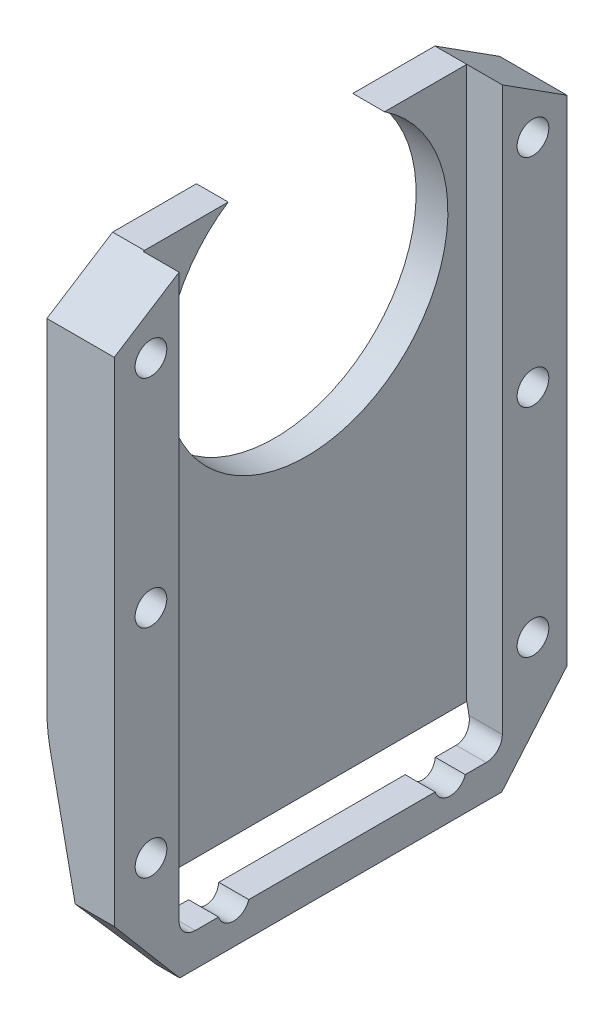
ISO-10303-21;
HEADER;
FILE_DESCRIPTION(('STEP AP214'),'2;1');
FILE_NAME('part.step','',(''),(''),'','','');
FILE_SCHEMA(('AUTOMOTIVE_DESIGN { 1 0 10303 214 1 1 1 1 }'));
ENDSEC;
DATA;
#1=APPLICATION_CONTEXT('core data for automotive mechanical design processes');
#2=APPLICATION_PROTOCOL_DEFINITION('international standard','automotive_design',2000,#1);
#3=PRODUCT_CONTEXT('',#1,'mechanical');
#4=PRODUCT('Part','Part','',(#3));
#5=PRODUCT_RELATED_PRODUCT_CATEGORY('part','',(#4));
#6=PRODUCT_DEFINITION_FORMATION('','',#4);
#7=PRODUCT_DEFINITION_CONTEXT('part definition',#1,'design');
#8=PRODUCT_DEFINITION('design','',#6,#7);
#9=PRODUCT_DEFINITION_SHAPE('','',#8);
#10=(LENGTH_UNIT() NAMED_UNIT(*) SI_UNIT(.MILLI.,.METRE.));
#11=(NAMED_UNIT(*) PLANE_ANGLE_UNIT() SI_UNIT($,.RADIAN.));
#12=(NAMED_UNIT(*) SI_UNIT($,.STERADIAN.) SOLID_ANGLE_UNIT());
#13=UNCERTAINTY_MEASURE_WITH_UNIT(LENGTH_MEASURE(1.E-05),#10,'distance_accuracy_value','');
#14=(GEOMETRIC_REPRESENTATION_CONTEXT(3) GLOBAL_UNCERTAINTY_ASSIGNED_CONTEXT((#13)) GLOBAL_UNIT_ASSIGNED_CONTEXT((#10,
#11,#12)) REPRESENTATION_CONTEXT('',''));
#15=CARTESIAN_POINT('',(0.,0.,0.));
#16=DIRECTION('',(0.,0.,1.));
#17=DIRECTION('',(1.,0.,0.));
#18=AXIS2_PLACEMENT_3D('',#15,#16,#17);
#19=CARTESIAN_POINT('',(-2.794,2.62272727272727,30.4699999999999));
#20=DIRECTION('',(0.,-1.,0.));
#21=DIRECTION('',(0.,0.,-1.));
#22=AXIS2_PLACEMENT_3D('',#19,#20,#21);
#23=PLANE('',#22);
#24=DIRECTION('',(0.,0.,-1.));
#25=VECTOR('',#24,1.);
#26=CARTESIAN_POINT('',(0.,2.62272727272727,30.4699999999999));
#27=LINE('',#26,#25);
#28=CARTESIAN_POINT('',(0.,2.62272727272727,24.9955931111425));
#29=VERTEX_POINT('',#28);
#30=CARTESIAN_POINT('',(0.,2.62272727272727,10.3615058849651));
#31=VERTEX_POINT('',#30);
#32=EDGE_CURVE('E200',#29,#31,#27,.T.);
#33=ORIENTED_EDGE('',*,*,#32,.T.);
#34=DIRECTION('',(-1.,0.,0.));
#35=VECTOR('',#34,1.);
#36=CARTESIAN_POINT('',(-5.288,2.62272727272727,10.3615058849651));
#37=LINE('',#36,#35);
#38=CARTESIAN_POINT('',(-2.35530757207496,2.62272727272727,10.3615058849651));
#39=VERTEX_POINT('',#38);
#40=EDGE_CURVE('E11',#31,#39,#37,.T.);
#41=ORIENTED_EDGE('',*,*,#40,.T.);
#42=DIRECTION('',(0.,0.,-1.));
#43=VECTOR('',#42,1.);
#44=CARTESIAN_POINT('',(-2.35530757207496,2.62272727272727,35.56));
#45=LINE('',#44,#43);
#46=CARTESIAN_POINT('',(-2.35530757207496,2.62272727272727,24.9955931111425));
#47=VERTEX_POINT('',#46);
#48=EDGE_CURVE('E272',#47,#39,#45,.T.);
#49=ORIENTED_EDGE('',*,*,#48,.F.);
#50=DIRECTION('',(-1.,0.,0.));
#51=VECTOR('',#50,1.);
#52=CARTESIAN_POINT('',(-5.288,2.62272727272727,24.9955931111425));
#53=LINE('',#52,#51);
#54=EDGE_CURVE('E205',#47,#29,#53,.F.);
#55=ORIENTED_EDGE('',*,*,#54,.T.);
#56=EDGE_LOOP('',(#33,#41,#49,#55));
#57=FACE_BOUND('',#56,.T.);
#58=ADVANCED_FACE('F37',(#57),#23,.F.);
#59=CARTESIAN_POINT('',(0.,2.62272727272727,29.1999999999999));
#60=VERTEX_POINT('',#59);
#61=CARTESIAN_POINT('',(0.,2.62272727272727,27.3681972057794));
#62=VERTEX_POINT('',#61);
#63=EDGE_CURVE('E206',#60,#62,#27,.T.);
#64=ORIENTED_EDGE('',*,*,#63,.T.);
#65=DIRECTION('',(-1.,0.,0.));
#66=VECTOR('',#65,1.);
#67=CARTESIAN_POINT('',(-5.288,2.62272727272727,27.3681972057794));
#68=LINE('',#67,#66);
#69=CARTESIAN_POINT('',(-2.35530757207496,2.62272727272727,27.3681972057794));
#70=VERTEX_POINT('',#69);
#71=EDGE_CURVE('E308',#62,#70,#68,.T.);
#72=ORIENTED_EDGE('',*,*,#71,.T.);
#73=CARTESIAN_POINT('',(-2.35530757207496,2.62272727272727,29.1999999999999));
#74=VERTEX_POINT('',#73);
#75=EDGE_CURVE('E268',#74,#70,#45,.T.);
#76=ORIENTED_EDGE('',*,*,#75,.F.);
#77=DIRECTION('',(1.,0.,0.));
#78=VECTOR('',#77,1.);
#79=CARTESIAN_POINT('',(0.,2.62272727272727,29.1999999999999));
#80=LINE('',#79,#78);
#81=EDGE_CURVE('E275',#74,#60,#80,.T.);
#82=ORIENTED_EDGE('',*,*,#81,.T.);
#83=EDGE_LOOP('',(#64,#72,#76,#82));
#84=FACE_BOUND('',#83,.T.);
#85=ADVANCED_FACE('F463',(#84),#23,.F.);
#86=CARTESIAN_POINT('',(0.,48.0727272727273,35.56));
#87=DIRECTION('',(0.,-1.,0.));
#88=DIRECTION('',(0.,0.,-1.));
#89=AXIS2_PLACEMENT_3D('',#86,#87,#88);
#90=PLANE('',#89);
#91=DIRECTION('',(0.,0.,1.));
#92=VECTOR('',#91,1.);
#93=CARTESIAN_POINT('',(-2.794,48.0727272727273,30.4699999999999));
#94=LINE('',#93,#92);
#95=CARTESIAN_POINT('',(-2.794,48.0727272727273,23.8169974277069));
#96=VERTEX_POINT('',#95);
#97=CARTESIAN_POINT('',(-2.794,48.0727272727273,30.3975808510955));
#98=VERTEX_POINT('',#97);
#99=EDGE_CURVE('E392',#96,#98,#94,.T.);
#100=ORIENTED_EDGE('',*,*,#99,.F.);
#101=DIRECTION('',(-1.,0.,0.));
#102=VECTOR('',#101,1.);
#103=CARTESIAN_POINT('',(-5.288,48.0727272727273,23.8169974277069));
#104=LINE('',#103,#102);
#105=CARTESIAN_POINT('',(-5.288,48.0727272727273,23.8169974277069));
#106=VERTEX_POINT('',#105);
#107=EDGE_CURVE('E304',#96,#106,#104,.T.);
#108=ORIENTED_EDGE('',*,*,#107,.T.);
#109=DIRECTION('',(0.,0.,-1.));
#110=VECTOR('',#109,1.);
#111=CARTESIAN_POINT('',(-5.288,48.0727272727273,35.56));
#112=LINE('',#111,#110);
#113=CARTESIAN_POINT('',(-5.288,48.0727272727273,30.3975808510955));
#114=VERTEX_POINT('',#113);
#115=EDGE_CURVE('E239',#114,#106,#112,.T.);
#116=ORIENTED_EDGE('',*,*,#115,.F.);
#117=DIRECTION('',(1.,0.,0.));
#118=VECTOR('',#117,1.);
#119=CARTESIAN_POINT('',(-5.288,48.0727272727273,30.3975808510955));
#120=LINE('',#119,#118);
#121=EDGE_CURVE('E381',#114,#98,#120,.T.);
#122=ORIENTED_EDGE('',*,*,#121,.T.);
#123=EDGE_LOOP('',(#100,#108,#116,#122));
#124=FACE_BOUND('',#123,.T.);
#125=ADVANCED_FACE('F405',(#124),#90,.F.);
#126=CARTESIAN_POINT('',(-5.288,48.0727272727273,35.56));
#127=DIRECTION('',(1.,0.,0.));
#128=DIRECTION('',(0.,0.,-1.));
#129=AXIS2_PLACEMENT_3D('',#126,#127,#128);
#130=PLANE('',#129);
#131=CARTESIAN_POINT('',(-5.288,43.3095233691544,2.67853591924794));
#132=DIRECTION('',(-1.,0.,0.));
#133=DIRECTION('',(0.,0.,1.));
#134=AXIS2_PLACEMENT_3D('',#131,#132,#133);
#135=CIRCLE('',#134,1.8796);
#136=CARTESIAN_POINT('',(-5.288,43.3095233691544,4.55813591924795));
#137=VERTEX_POINT('',#136);
#138=EDGE_CURVE('E724',#137,#137,#135,.T.);
#139=ORIENTED_EDGE('',*,*,#138,.F.);
#140=EDGE_LOOP('',(#139));
#141=FACE_BOUND('',#140,.T.);
#142=CARTESIAN_POINT('',(-5.288,26.3095233691544,2.67853591924794));
#143=DIRECTION('',(-1.,0.,0.));
#144=DIRECTION('',(0.,0.,1.));
#145=AXIS2_PLACEMENT_3D('',#142,#143,#144);
#146=CIRCLE('',#145,1.8796);
#147=CARTESIAN_POINT('',(-5.288,26.3095233691544,4.55813591924794));
#148=VERTEX_POINT('',#147);
#149=EDGE_CURVE('E731',#148,#148,#146,.T.);
#150=ORIENTED_EDGE('',*,*,#149,.F.);
#151=EDGE_LOOP('',(#150));
#152=FACE_BOUND('',#151,.T.);
#153=CARTESIAN_POINT('',(-5.288,26.3095233691544,32.6785359192479));
#154=DIRECTION('',(-1.,0.,0.));
#155=DIRECTION('',(0.,0.,1.));
#156=AXIS2_PLACEMENT_3D('',#153,#154,#155);
#157=CIRCLE('',#156,1.8796);
#158=CARTESIAN_POINT('',(-5.288,26.3095233691544,34.5581359192479));
#159=VERTEX_POINT('',#158);
#160=EDGE_CURVE('E329',#159,#159,#157,.T.);
#161=ORIENTED_EDGE('',*,*,#160,.F.);
#162=EDGE_LOOP('',(#161));
#163=FACE_BOUND('',#162,.T.);
#164=CARTESIAN_POINT('',(-5.288,43.2991799424324,32.6785359192479));
#165=DIRECTION('',(-1.,0.,0.));
#166=DIRECTION('',(0.,0.,1.));
#167=AXIS2_PLACEMENT_3D('',#164,#165,#166);
#168=CIRCLE('',#167,1.8796);
#169=CARTESIAN_POINT('',(-5.288,43.2991799424324,34.558135919248));
#170=VERTEX_POINT('',#169);
#171=EDGE_CURVE('E338',#170,#170,#168,.T.);
#172=ORIENTED_EDGE('',*,*,#171,.F.);
#173=EDGE_LOOP('',(#172));
#174=FACE_BOUND('',#173,.T.);
#175=CARTESIAN_POINT('',(-5.288,38.8095233691544,17.6785359192479));
#176=DIRECTION('',(-1.,0.,0.));
#177=DIRECTION('',(0.,0.,1.));
#178=AXIS2_PLACEMENT_3D('',#175,#176,#177);
#179=CIRCLE('',#178,11.1125);
#180=CARTESIAN_POINT('',(-5.288,48.0727272727273,11.540074410789));
#181=VERTEX_POINT('',#180);
#182=EDGE_CURVE('E300',#181,#106,#179,.T.);
#183=ORIENTED_EDGE('',*,*,#182,.F.);
#184=CARTESIAN_POINT('',(-5.288,48.0727272727273,5.08554511743511));
#185=VERTEX_POINT('',#184);
#186=EDGE_CURVE('E238',#181,#185,#112,.T.);
#187=ORIENTED_EDGE('',*,*,#186,.T.);
#188=DIRECTION('',(0.,-0.538240235923672,-0.842791462007554));
#189=VECTOR('',#188,1.);
#190=CARTESIAN_POINT('',(-5.288,44.8248953626975,0.));
#191=LINE('',#190,#189);
#192=CARTESIAN_POINT('',(-5.288,44.8248953626975,0.));
#193=VERTEX_POINT('',#192);
#194=EDGE_CURVE('E351',#185,#193,#191,.T.);
#195=ORIENTED_EDGE('',*,*,#194,.T.);
#196=DIRECTION('',(0.,-1.,0.));
#197=VECTOR('',#196,1.);
#198=CARTESIAN_POINT('',(-5.288,48.0727272727273,0.));
#199=LINE('',#198,#197);
#200=CARTESIAN_POINT('',(-5.288,18.1229669634941,0.));
#201=VERTEX_POINT('',#200);
#202=EDGE_CURVE('E232',#193,#201,#199,.T.);
#203=ORIENTED_EDGE('',*,*,#202,.T.);
#204=DIRECTION('',(0.,0.,-1.));
#205=VECTOR('',#204,1.);
#206=CARTESIAN_POINT('',(-5.288,18.1229669634941,35.56));
#207=LINE('',#206,#205);
#208=CARTESIAN_POINT('',(-5.288,18.1229669634941,35.56));
#209=VERTEX_POINT('',#208);
#210=EDGE_CURVE('E254',#201,#209,#207,.F.);
#211=ORIENTED_EDGE('',*,*,#210,.T.);
#212=DIRECTION('',(0.,-1.,0.));
#213=VECTOR('',#212,1.);
#214=CARTESIAN_POINT('',(-5.288,48.0727272727273,35.56));
#215=LINE('',#214,#213);
#216=CARTESIAN_POINT('',(-5.288,44.780420684171,35.56));
#217=VERTEX_POINT('',#216);
#218=EDGE_CURVE('E223',#217,#209,#215,.T.);
#219=ORIENTED_EDGE('',*,*,#218,.F.);
#220=DIRECTION('',(0.,0.537704159105509,-0.843133582109406));
#221=VECTOR('',#220,1.);
#222=CARTESIAN_POINT('',(-5.288,44.780420684171,35.56));
#223=LINE('',#222,#221);
#224=EDGE_CURVE('E376',#217,#114,#223,.T.);
#225=ORIENTED_EDGE('',*,*,#224,.T.);
#226=ORIENTED_EDGE('',*,*,#115,.T.);
#227=EDGE_LOOP('',(#183,#187,#195,#203,#211,#219,#225,#226));
#228=FACE_BOUND('',#227,.T.);
#229=ADVANCED_FACE('F408',(#141,#152,#163,#174,#228),#130,.F.);
#230=CARTESIAN_POINT('',(-1.81374592229171,0.,35.56));
#231=DIRECTION('',(0.,1.,0.));
#232=DIRECTION('',(0.,0.,1.));
#233=AXIS2_PLACEMENT_3D('',#230,#231,#232);
#234=PLANE('',#233);
#235=DIRECTION('',(0.,0.,-1.));
#236=VECTOR('',#235,1.);
#237=CARTESIAN_POINT('',(-1.81374592229171,0.,35.56));
#238=LINE('',#237,#236);
#239=CARTESIAN_POINT('',(-1.81374592229171,0.,30.4170918583045));
#240=VERTEX_POINT('',#239);
#241=CARTESIAN_POINT('',(-1.81374592229171,0.,5.12869281639009));
#242=VERTEX_POINT('',#241);
#243=EDGE_CURVE('E229',#240,#242,#238,.T.);
#244=ORIENTED_EDGE('',*,*,#243,.T.);
#245=DIRECTION('',(1.,0.,0.));
#246=VECTOR('',#245,1.);
#247=CARTESIAN_POINT('',(-5.288,0.,5.12869281639009));
#248=LINE('',#247,#246);
#249=CARTESIAN_POINT('',(0.,0.,5.12869281639009));
#250=VERTEX_POINT('',#249);
#251=EDGE_CURVE('E363',#242,#250,#248,.T.);
#252=ORIENTED_EDGE('',*,*,#251,.T.);
#253=DIRECTION('',(0.,0.,-1.));
#254=VECTOR('',#253,1.);
#255=CARTESIAN_POINT('',(0.,0.,35.56));
#256=LINE('',#255,#254);
#257=CARTESIAN_POINT('',(0.,0.,30.4170918583045));
#258=VERTEX_POINT('',#257);
#259=EDGE_CURVE('E245',#258,#250,#256,.T.);
#260=ORIENTED_EDGE('',*,*,#259,.F.);
#261=DIRECTION('',(1.,0.,0.));
#262=VECTOR('',#261,1.);
#263=CARTESIAN_POINT('',(-5.288,0.,30.4170918583045));
#264=LINE('',#263,#262);
#265=EDGE_CURVE('E350',#240,#258,#264,.T.);
#266=ORIENTED_EDGE('',*,*,#265,.F.);
#267=EDGE_LOOP('',(#244,#252,#260,#266));
#268=FACE_BOUND('',#267,.T.);
#269=ADVANCED_FACE('F554',(#268),#234,.F.);
#270=CARTESIAN_POINT('',(0.,0.,35.56));
#271=DIRECTION('',(-1.,0.,0.));
#272=DIRECTION('',(0.,0.,1.));
#273=AXIS2_PLACEMENT_3D('',#270,#271,#272);
#274=PLANE('',#273);
#275=CARTESIAN_POINT('',(0.,43.3095233691544,2.67853591924794));
#276=DIRECTION('',(-1.,0.,0.));
#277=DIRECTION('',(0.,0.,1.));
#278=AXIS2_PLACEMENT_3D('',#275,#276,#277);
#279=CIRCLE('',#278,1.2446);
#280=CARTESIAN_POINT('',(0.,43.3095233691544,3.92313591924794));
#281=VERTEX_POINT('',#280);
#282=EDGE_CURVE('E726',#281,#281,#279,.T.);
#283=ORIENTED_EDGE('',*,*,#282,.T.);
#284=EDGE_LOOP('',(#283));
#285=FACE_BOUND('',#284,.T.);
#286=CARTESIAN_POINT('',(0.,26.3095233691544,2.67853591924794));
#287=DIRECTION('',(-1.,0.,0.));
#288=DIRECTION('',(0.,0.,1.));
#289=AXIS2_PLACEMENT_3D('',#286,#287,#288);
#290=CIRCLE('',#289,1.2446);
#291=CARTESIAN_POINT('',(0.,26.3095233691544,3.92313591924794));
#292=VERTEX_POINT('',#291);
#293=EDGE_CURVE('E737',#292,#292,#290,.T.);
#294=ORIENTED_EDGE('',*,*,#293,.T.);
#295=EDGE_LOOP('',(#294));
#296=FACE_BOUND('',#295,.T.);
#297=CARTESIAN_POINT('',(0.,9.30952336915439,2.67853591924794));
#298=DIRECTION('',(-1.,0.,0.));
#299=DIRECTION('',(0.,0.,1.));
#300=AXIS2_PLACEMENT_3D('',#297,#298,#299);
#301=CIRCLE('',#300,1.2446);
#302=CARTESIAN_POINT('',(0.,9.30952336915439,3.92313591924794));
#303=VERTEX_POINT('',#302);
#304=EDGE_CURVE('E740',#303,#303,#301,.T.);
#305=ORIENTED_EDGE('',*,*,#304,.T.);
#306=EDGE_LOOP('',(#305));
#307=FACE_BOUND('',#306,.T.);
#308=CARTESIAN_POINT('',(0.,9.2991799424324,32.6729429087411));
#309=DIRECTION('',(-1.,0.,0.));
#310=DIRECTION('',(0.,0.,1.));
#311=AXIS2_PLACEMENT_3D('',#308,#309,#310);
#312=CIRCLE('',#311,1.2446);
#313=CARTESIAN_POINT('',(0.,9.2991799424324,33.9175429087411));
#314=VERTEX_POINT('',#313);
#315=EDGE_CURVE('E323',#314,#314,#312,.T.);
#316=ORIENTED_EDGE('',*,*,#315,.T.);
#317=EDGE_LOOP('',(#316));
#318=FACE_BOUND('',#317,.T.);
#319=CARTESIAN_POINT('',(0.,26.3095233691544,32.6785359192479));
#320=DIRECTION('',(-1.,0.,0.));
#321=DIRECTION('',(0.,0.,1.));
#322=AXIS2_PLACEMENT_3D('',#319,#320,#321);
#323=CIRCLE('',#322,1.2446);
#324=CARTESIAN_POINT('',(0.,26.3095233691544,33.9231359192479));
#325=VERTEX_POINT('',#324);
#326=EDGE_CURVE('E335',#325,#325,#323,.T.);
#327=ORIENTED_EDGE('',*,*,#326,.T.);
#328=EDGE_LOOP('',(#327));
#329=FACE_BOUND('',#328,.T.);
#330=CARTESIAN_POINT('',(0.,43.2991799424324,32.6785359192479));
#331=DIRECTION('',(-1.,0.,0.));
#332=DIRECTION('',(0.,0.,1.));
#333=AXIS2_PLACEMENT_3D('',#330,#331,#332);
#334=CIRCLE('',#333,1.2446);
#335=CARTESIAN_POINT('',(0.,43.2991799424324,33.9231359192479));
#336=VERTEX_POINT('',#335);
#337=EDGE_CURVE('E344',#336,#336,#334,.T.);
#338=ORIENTED_EDGE('',*,*,#337,.T.);
#339=EDGE_LOOP('',(#338));
#340=FACE_BOUND('',#339,.T.);
#341=CARTESIAN_POINT('',(0.,2.62272727272727,7.99556595353083));
#342=VERTEX_POINT('',#341);
#343=CARTESIAN_POINT('',(0.,2.62272727272727,6.35599999999986));
#344=VERTEX_POINT('',#343);
#345=EDGE_CURVE('E202',#342,#344,#27,.T.);
#346=ORIENTED_EDGE('',*,*,#345,.F.);
#347=CARTESIAN_POINT('',(0.,3.00952336915439,9.17853591924794));
#348=DIRECTION('',(-1.,0.,0.));
#349=DIRECTION('',(0.,0.,1.));
#350=AXIS2_PLACEMENT_3D('',#347,#348,#349);
#351=CIRCLE('',#350,1.2446);
#352=EDGE_CURVE('E52',#342,#31,#351,.T.);
#353=ORIENTED_EDGE('',*,*,#352,.T.);
#354=ORIENTED_EDGE('',*,*,#32,.F.);
#355=CARTESIAN_POINT('',(0.,2.9991799424324,26.181895158461));
#356=DIRECTION('',(-1.,0.,0.));
#357=DIRECTION('',(0.,0.,1.));
#358=AXIS2_PLACEMENT_3D('',#355,#356,#357);
#359=CIRCLE('',#358,1.2446);
#360=EDGE_CURVE('E60',#29,#62,#359,.T.);
#361=ORIENTED_EDGE('',*,*,#360,.T.);
#362=ORIENTED_EDGE('',*,*,#63,.F.);
#363=CARTESIAN_POINT('',(0.,3.89272727272727,29.1999999999999));
#364=DIRECTION('',(-1.,0.,0.));
#365=DIRECTION('',(0.,0.,1.));
#366=AXIS2_PLACEMENT_3D('',#363,#364,#365);
#367=CIRCLE('',#366,1.27);
#368=CARTESIAN_POINT('',(0.,3.89272727272727,30.4699999999999));
#369=VERTEX_POINT('',#368);
#370=EDGE_CURVE('E283',#60,#369,#367,.T.);
#371=ORIENTED_EDGE('',*,*,#370,.T.);
#372=DIRECTION('',(0.,-1.,0.));
#373=VECTOR('',#372,1.);
#374=CARTESIAN_POINT('',(0.,48.0727272727273,30.4699999999999));
#375=LINE('',#374,#373);
#376=CARTESIAN_POINT('',(0.,48.0265423283827,30.4699999999999));
#377=VERTEX_POINT('',#376);
#378=EDGE_CURVE('E210',#377,#369,#375,.T.);
#379=ORIENTED_EDGE('',*,*,#378,.F.);
#380=DIRECTION('',(0.,0.537704159105509,-0.843133582109406));
#381=VECTOR('',#380,1.);
#382=CARTESIAN_POINT('',(0.,44.780420684171,35.56));
#383=LINE('',#382,#381);
#384=CARTESIAN_POINT('',(0.,44.780420684171,35.56));
#385=VERTEX_POINT('',#384);
#386=EDGE_CURVE('E375',#385,#377,#383,.T.);
#387=ORIENTED_EDGE('',*,*,#386,.F.);
#388=DIRECTION('',(0.,1.,0.));
#389=VECTOR('',#388,1.);
#390=CARTESIAN_POINT('',(0.,0.,35.56));
#391=LINE('',#390,#389);
#392=CARTESIAN_POINT('',(0.,6.07121687996455,35.56));
#393=VERTEX_POINT('',#392);
#394=EDGE_CURVE('E221',#393,#385,#391,.T.);
#395=ORIENTED_EDGE('',*,*,#394,.F.);
#396=DIRECTION('',(0.,0.763031396083279,0.646361422573472));
#397=VECTOR('',#396,1.);
#398=CARTESIAN_POINT('',(0.,0.,30.4170918583045));
#399=LINE('',#398,#397);
#400=EDGE_CURVE('E366',#258,#393,#399,.T.);
#401=ORIENTED_EDGE('',*,*,#400,.F.);
#402=ORIENTED_EDGE('',*,*,#259,.T.);
#403=DIRECTION('',(0.,-0.761715388262673,0.647911774305611));
#404=VECTOR('',#403,1.);
#405=CARTESIAN_POINT('',(0.,6.02953117205409,0.));
#406=LINE('',#405,#404);
#407=CARTESIAN_POINT('',(0.,6.02953117205409,0.));
#408=VERTEX_POINT('',#407);
#409=EDGE_CURVE('E357',#408,#250,#406,.T.);
#410=ORIENTED_EDGE('',*,*,#409,.F.);
#411=DIRECTION('',(0.,1.,0.));
#412=VECTOR('',#411,1.);
#413=CARTESIAN_POINT('',(0.,0.,0.));
#414=LINE('',#413,#412);
#415=CARTESIAN_POINT('',(0.,44.8248953626975,0.));
#416=VERTEX_POINT('',#415);
#417=EDGE_CURVE('E219',#408,#416,#414,.T.);
#418=ORIENTED_EDGE('',*,*,#417,.T.);
#419=DIRECTION('',(0.,-0.538240235923672,-0.842791462007554));
#420=VECTOR('',#419,1.);
#421=CARTESIAN_POINT('',(0.,44.8248953626975,0.));
#422=LINE('',#421,#420);
#423=CARTESIAN_POINT('',(0.,48.0727272727273,5.08554511743511));
#424=VERTEX_POINT('',#423);
#425=EDGE_CURVE('E355',#424,#416,#422,.T.);
#426=ORIENTED_EDGE('',*,*,#425,.F.);
#427=DIRECTION('',(0.,0.,-1.));
#428=VECTOR('',#427,1.);
#429=CARTESIAN_POINT('',(0.,48.0727272727273,35.56));
#430=LINE('',#429,#428);
#431=CARTESIAN_POINT('',(0.,48.0727272727273,5.08599999999987));
#432=VERTEX_POINT('',#431);
#433=EDGE_CURVE('E242',#432,#424,#430,.T.);
#434=ORIENTED_EDGE('',*,*,#433,.F.);
#435=DIRECTION('',(0.,1.,0.));
#436=VECTOR('',#435,1.);
#437=CARTESIAN_POINT('',(0.,48.0727272727273,5.08599999999987));
#438=LINE('',#437,#436);
#439=CARTESIAN_POINT('',(0.,3.89272727272727,5.08599999999987));
#440=VERTEX_POINT('',#439);
#441=EDGE_CURVE('E209',#440,#432,#438,.T.);
#442=ORIENTED_EDGE('',*,*,#441,.F.);
#443=CARTESIAN_POINT('',(0.,3.89272727272727,6.35599999999986));
#444=DIRECTION('',(-1.,0.,0.));
#445=DIRECTION('',(0.,0.,1.));
#446=AXIS2_PLACEMENT_3D('',#443,#444,#445);
#447=CIRCLE('',#446,1.27);
#448=EDGE_CURVE('E288',#440,#344,#447,.T.);
#449=ORIENTED_EDGE('',*,*,#448,.T.);
#450=EDGE_LOOP('',(#346,#353,#354,#361,#362,#371,#379,#387,#395,#401,#402,#410,#418,#426,#434,
#442,#449));
#451=FACE_BOUND('',#450,.T.);
#452=ADVANCED_FACE('F199',(#285,#296,#307,#318,#329,#340,#451),#274,.F.);
#453=ORIENTED_EDGE('',*,*,#186,.F.);
#454=DIRECTION('',(-1.,0.,0.));
#455=VECTOR('',#454,1.);
#456=CARTESIAN_POINT('',(-5.288,48.0727272727273,11.540074410789));
#457=LINE('',#456,#455);
#458=CARTESIAN_POINT('',(-2.794,48.0727272727273,11.540074410789));
#459=VERTEX_POINT('',#458);
#460=EDGE_CURVE('E301',#181,#459,#457,.F.);
#461=ORIENTED_EDGE('',*,*,#460,.T.);
#462=CARTESIAN_POINT('',(-2.794,48.0727272727273,5.08599999999987));
#463=VERTEX_POINT('',#462);
#464=EDGE_CURVE('E220',#463,#459,#94,.T.);
#465=ORIENTED_EDGE('',*,*,#464,.F.);
#466=DIRECTION('',(1.,0.,0.));
#467=VECTOR('',#466,1.);
#468=CARTESIAN_POINT('',(-2.794,48.0727272727273,5.08599999999987));
#469=LINE('',#468,#467);
#470=EDGE_CURVE('E216',#463,#432,#469,.T.);
#471=ORIENTED_EDGE('',*,*,#470,.T.);
#472=ORIENTED_EDGE('',*,*,#433,.T.);
#473=DIRECTION('',(1.,0.,0.));
#474=VECTOR('',#473,1.);
#475=CARTESIAN_POINT('',(-5.288,48.0727272727273,5.08554511743511));
#476=LINE('',#475,#474);
#477=EDGE_CURVE('E358',#185,#424,#476,.T.);
#478=ORIENTED_EDGE('',*,*,#477,.F.);
#479=EDGE_LOOP('',(#453,#461,#465,#471,#472,#478));
#480=FACE_BOUND('',#479,.T.);
#481=ADVANCED_FACE('F432',(#480),#90,.F.);
#482=CARTESIAN_POINT('',(-5.288,16.8254545454545,35.56));
#483=DIRECTION('',(0.979339732195538,0.20222188047581,0.));
#484=DIRECTION('',(-0.20222188047581,0.979339732195538,0.));
#485=AXIS2_PLACEMENT_3D('',#482,#483,#484);
#486=PLANE('',#485);
#487=CARTESIAN_POINT('',(-3.73605057322568,9.30952336915439,2.67853591924794));
#488=DIRECTION('',(0.979339732195538,0.20222188047581,0.));
#489=DIRECTION('',(-0.20222188047581,0.979339732195538,0.));
#490=AXIS2_PLACEMENT_3D('',#487,#488,#489);
#491=ELLIPSE('',#490,1.27085623005388,1.2446);
#492=CARTESIAN_POINT('',(-3.99304550988157,10.5541233691544,2.67853591924794));
#493=VERTEX_POINT('',#492);
#494=EDGE_CURVE('E203',#493,#493,#491,.T.);
#495=ORIENTED_EDGE('',*,*,#494,.T.);
#496=EDGE_LOOP('',(#495));
#497=FACE_BOUND('',#496,.T.);
#498=CARTESIAN_POINT('',(-3.7339147799626,9.2991799424324,32.6729429087411));
#499=DIRECTION('',(0.979339732195538,0.20222188047581,0.));
#500=DIRECTION('',(-0.20222188047581,0.979339732195538,0.));
#501=AXIS2_PLACEMENT_3D('',#498,#499,#500);
#502=ELLIPSE('',#501,1.27085623005388,1.2446);
#503=CARTESIAN_POINT('',(-3.9909097166185,10.5437799424324,32.6729429087411));
#504=VERTEX_POINT('',#503);
#505=EDGE_CURVE('E326',#504,#504,#502,.T.);
#506=ORIENTED_EDGE('',*,*,#505,.T.);
#507=EDGE_LOOP('',(#506));
#508=FACE_BOUND('',#507,.T.);
#509=ORIENTED_EDGE('',*,*,#48,.T.);
#510=CARTESIAN_POINT('',(-2.4351763156874,3.00952336915439,9.17853591924794));
#511=DIRECTION('',(0.979339732195538,0.20222188047581,0.));
#512=DIRECTION('',(-0.20222188047581,0.979339732195538,0.));
#513=AXIS2_PLACEMENT_3D('',#510,#511,#512);
#514=ELLIPSE('',#513,1.27085623005388,1.2446);
#515=CARTESIAN_POINT('',(-2.35530757207496,2.62272727272727,7.99556595353084));
#516=VERTEX_POINT('',#515);
#517=EDGE_CURVE('E191',#39,#516,#514,.T.);
#518=ORIENTED_EDGE('',*,*,#517,.T.);
#519=CARTESIAN_POINT('',(-2.35530757207496,2.62272727272727,6.35599999999987));
#520=VERTEX_POINT('',#519);
#521=EDGE_CURVE('E267',#516,#520,#45,.T.);
#522=ORIENTED_EDGE('',*,*,#521,.T.);
#523=CARTESIAN_POINT('',(-2.61754730335649,3.89272727272727,6.35599999999986));
#524=DIRECTION('',(0.979339732195538,0.20222188047581,0.));
#525=DIRECTION('',(-0.20222188047581,0.979339732195538,0.));
#526=AXIS2_PLACEMENT_3D('',#523,#524,#525);
#527=ELLIPSE('',#526,1.29679207148355,1.27);
#528=CARTESIAN_POINT('',(-2.61754730335649,3.89272727272727,5.08599999999986));
#529=VERTEX_POINT('',#528);
#530=EDGE_CURVE('E290',#520,#529,#527,.T.);
#531=ORIENTED_EDGE('',*,*,#530,.T.);
#532=DIRECTION('',(-0.20222188047581,0.979339732195538,0.));
#533=VECTOR('',#532,1.);
#534=CARTESIAN_POINT('',(-5.288,16.8254545454545,5.08599999999987));
#535=LINE('',#534,#533);
#536=CARTESIAN_POINT('',(-2.794,4.74726950262561,5.08599999999987));
#537=VERTEX_POINT('',#536);
#538=EDGE_CURVE('E262',#529,#537,#535,.T.);
#539=ORIENTED_EDGE('',*,*,#538,.T.);
#540=DIRECTION('',(0.,0.,-1.));
#541=VECTOR('',#540,1.);
#542=CARTESIAN_POINT('',(-2.794,4.74726950262562,35.56));
#543=LINE('',#542,#541);
#544=CARTESIAN_POINT('',(-2.794,4.74726950262562,30.4699999999999));
#545=VERTEX_POINT('',#544);
#546=EDGE_CURVE('E259',#545,#537,#543,.T.);
#547=ORIENTED_EDGE('',*,*,#546,.F.);
#548=DIRECTION('',(0.20222188047581,-0.979339732195538,0.));
#549=VECTOR('',#548,1.);
#550=CARTESIAN_POINT('',(-5.288,16.8254545454545,30.4699999999999));
#551=LINE('',#550,#549);
#552=CARTESIAN_POINT('',(-2.61754730335649,3.89272727272727,30.4699999999999));
#553=VERTEX_POINT('',#552);
#554=EDGE_CURVE('E264',#545,#553,#551,.T.);
#555=ORIENTED_EDGE('',*,*,#554,.T.);
#556=CARTESIAN_POINT('',(-2.61754730335649,3.89272727272727,29.1999999999999));
#557=DIRECTION('',(0.979339732195538,0.20222188047581,0.));
#558=DIRECTION('',(-0.20222188047581,0.979339732195538,0.));
#559=AXIS2_PLACEMENT_3D('',#556,#557,#558);
#560=ELLIPSE('',#559,1.29679207148355,1.27);
#561=EDGE_CURVE('E286',#553,#74,#560,.T.);
#562=ORIENTED_EDGE('',*,*,#561,.T.);
#563=ORIENTED_EDGE('',*,*,#75,.T.);
#564=CARTESIAN_POINT('',(-2.43304052242432,2.9991799424324,26.181895158461));
#565=DIRECTION('',(0.979339732195538,0.20222188047581,0.));
#566=DIRECTION('',(-0.20222188047581,0.979339732195538,0.));
#567=AXIS2_PLACEMENT_3D('',#564,#565,#566);
#568=ELLIPSE('',#567,1.27085623005388,1.2446);
#569=EDGE_CURVE('E318',#70,#47,#568,.T.);
#570=ORIENTED_EDGE('',*,*,#569,.T.);
#571=EDGE_LOOP('',(#509,#518,#522,#531,#539,#547,#555,#562,#563,#570));
#572=FACE_BOUND('',#571,.T.);
#573=DIRECTION('',(0.20222188047581,-0.979339732195537,0.));
#574=VECTOR('',#573,1.);
#575=CARTESIAN_POINT('',(-5.288,16.8254545454545,0.));
#576=LINE('',#575,#574);
#577=CARTESIAN_POINT('',(-5.02561459888333,15.5547490814513,0.));
#578=VERTEX_POINT('',#577);
#579=CARTESIAN_POINT('',(-3.0587716186012,6.02953117205409,0.));
#580=VERTEX_POINT('',#579);
#581=EDGE_CURVE('E224',#578,#580,#576,.T.);
#582=ORIENTED_EDGE('',*,*,#581,.T.);
#583=DIRECTION('',(0.155374932595926,-0.752464790260893,0.640043256146366));
#584=VECTOR('',#583,1.);
#585=CARTESIAN_POINT('',(-0.838460761250953,-4.72320555115297,9.14623077901076));
#586=LINE('',#585,#584);
#587=EDGE_CURVE('E360',#580,#242,#586,.T.);
#588=ORIENTED_EDGE('',*,*,#587,.T.);
#589=ORIENTED_EDGE('',*,*,#243,.F.);
#590=DIRECTION('',(-0.155636875365988,0.753733352108303,0.638485079658008));
#591=VECTOR('',#590,1.);
#592=CARTESIAN_POINT('',(-4.38273463203637,12.4413476380249,40.9561171190255));
#593=LINE('',#592,#591);
#594=CARTESIAN_POINT('',(-3.06737921611358,6.07121687996455,35.56));
#595=VERTEX_POINT('',#594);
#596=EDGE_CURVE('E372',#240,#595,#593,.T.);
#597=ORIENTED_EDGE('',*,*,#596,.T.);
#598=DIRECTION('',(0.20222188047581,-0.979339732195537,0.));
#599=VECTOR('',#598,1.);
#600=CARTESIAN_POINT('',(-5.288,16.8254545454545,35.56));
#601=LINE('',#600,#599);
#602=CARTESIAN_POINT('',(-5.02561459888333,15.5547490814513,35.56));
#603=VERTEX_POINT('',#602);
#604=EDGE_CURVE('E226',#603,#595,#601,.T.);
#605=ORIENTED_EDGE('',*,*,#604,.F.);
#606=DIRECTION('',(0.,0.,-1.));
#607=VECTOR('',#606,1.);
#608=CARTESIAN_POINT('',(-5.02561459888333,15.5547490814513,35.56));
#609=LINE('',#608,#607);
#610=EDGE_CURVE('E248',#603,#578,#609,.T.);
#611=ORIENTED_EDGE('',*,*,#610,.T.);
#612=EDGE_LOOP('',(#582,#588,#589,#597,#605,#611));
#613=FACE_BOUND('',#612,.T.);
#614=ADVANCED_FACE('F314',(#497,#508,#572,#613),#486,.F.);
#615=CARTESIAN_POINT('',(0.,0.,35.56));
#616=DIRECTION('',(0.,0.,1.));
#617=DIRECTION('',(1.,0.,0.));
#618=AXIS2_PLACEMENT_3D('',#615,#616,#617);
#619=PLANE('',#618);
#620=DIRECTION('',(-1.,0.,0.));
#621=VECTOR('',#620,1.);
#622=CARTESIAN_POINT('',(0.,6.07121687996455,35.56));
#623=LINE('',#622,#621);
#624=EDGE_CURVE('E298',#393,#595,#623,.T.);
#625=ORIENTED_EDGE('',*,*,#624,.F.);
#626=ORIENTED_EDGE('',*,*,#394,.T.);
#627=DIRECTION('',(1.,0.,0.));
#628=VECTOR('',#627,1.);
#629=CARTESIAN_POINT('',(-5.288,44.780420684171,35.56));
#630=LINE('',#629,#628);
#631=EDGE_CURVE('E379',#217,#385,#630,.T.);
#632=ORIENTED_EDGE('',*,*,#631,.F.);
#633=ORIENTED_EDGE('',*,*,#218,.T.);
#634=CARTESIAN_POINT('',(7.412,18.1229669634941,35.56));
#635=DIRECTION('',(0.,0.,1.));
#636=DIRECTION('',(1.,0.,0.));
#637=AXIS2_PLACEMENT_3D('',#634,#635,#636);
#638=CIRCLE('',#637,12.7);
#639=EDGE_CURVE('E257',#209,#603,#638,.T.);
#640=ORIENTED_EDGE('',*,*,#639,.T.);
#641=ORIENTED_EDGE('',*,*,#604,.T.);
#642=EDGE_LOOP('',(#625,#626,#632,#633,#640,#641));
#643=FACE_BOUND('',#642,.T.);
#644=ADVANCED_FACE('F415',(#643),#619,.T.);
#645=CARTESIAN_POINT('',(0.,0.,0.));
#646=DIRECTION('',(0.,0.,1.));
#647=DIRECTION('',(1.,0.,0.));
#648=AXIS2_PLACEMENT_3D('',#645,#646,#647);
#649=PLANE('',#648);
#650=ORIENTED_EDGE('',*,*,#202,.F.);
#651=DIRECTION('',(1.,0.,0.));
#652=VECTOR('',#651,1.);
#653=CARTESIAN_POINT('',(-5.288,44.8248953626975,0.));
#654=LINE('',#653,#652);
#655=EDGE_CURVE('E354',#193,#416,#654,.T.);
#656=ORIENTED_EDGE('',*,*,#655,.T.);
#657=ORIENTED_EDGE('',*,*,#417,.F.);
#658=DIRECTION('',(-1.,0.,0.));
#659=VECTOR('',#658,1.);
#660=CARTESIAN_POINT('',(0.,6.02953117205409,0.));
#661=LINE('',#660,#659);
#662=EDGE_CURVE('E295',#408,#580,#661,.T.);
#663=ORIENTED_EDGE('',*,*,#662,.T.);
#664=ORIENTED_EDGE('',*,*,#581,.F.);
#665=CARTESIAN_POINT('',(7.412,18.1229669634941,0.));
#666=DIRECTION('',(0.,0.,1.));
#667=DIRECTION('',(1.,0.,0.));
#668=AXIS2_PLACEMENT_3D('',#665,#666,#667);
#669=CIRCLE('',#668,12.7);
#670=EDGE_CURVE('E251',#578,#201,#669,.F.);
#671=ORIENTED_EDGE('',*,*,#670,.T.);
#672=EDGE_LOOP('',(#650,#656,#657,#663,#664,#671));
#673=FACE_BOUND('',#672,.T.);
#674=ADVANCED_FACE('F442',(#673),#649,.F.);
#675=CARTESIAN_POINT('',(7.412,18.1229669634941,35.56));
#676=DIRECTION('',(0.,0.,-1.));
#677=DIRECTION('',(-1.,0.,0.));
#678=AXIS2_PLACEMENT_3D('',#675,#676,#677);
#679=CYLINDRICAL_SURFACE('',#678,12.7);
#680=ORIENTED_EDGE('',*,*,#639,.F.);
#681=ORIENTED_EDGE('',*,*,#210,.F.);
#682=ORIENTED_EDGE('',*,*,#670,.F.);
#683=ORIENTED_EDGE('',*,*,#610,.F.);
#684=EDGE_LOOP('',(#680,#681,#682,#683));
#685=FACE_BOUND('',#684,.T.);
#686=ADVANCED_FACE('F481',(#685),#679,.T.);
#687=CARTESIAN_POINT('',(-2.794,48.0727272727273,30.4699999999999));
#688=DIRECTION('',(0.,0.,1.));
#689=DIRECTION('',(0.,-1.,0.));
#690=AXIS2_PLACEMENT_3D('',#687,#688,#689);
#691=PLANE('',#690);
#692=DIRECTION('',(0.,-1.,0.));
#693=VECTOR('',#692,1.);
#694=CARTESIAN_POINT('',(-2.794,48.0727272727273,30.4699999999999));
#695=LINE('',#694,#693);
#696=CARTESIAN_POINT('',(-2.794,48.0265423283827,30.4699999999999));
#697=VERTEX_POINT('',#696);
#698=EDGE_CURVE('E215',#697,#545,#695,.T.);
#699=ORIENTED_EDGE('',*,*,#698,.F.);
#700=DIRECTION('',(1.,0.,0.));
#701=VECTOR('',#700,1.);
#702=CARTESIAN_POINT('',(-2.794,48.0265423283827,30.4699999999999));
#703=LINE('',#702,#701);
#704=EDGE_CURVE('E384',#697,#377,#703,.T.);
#705=ORIENTED_EDGE('',*,*,#704,.T.);
#706=ORIENTED_EDGE('',*,*,#378,.T.);
#707=DIRECTION('',(1.,0.,0.));
#708=VECTOR('',#707,1.);
#709=CARTESIAN_POINT('',(-2.35530757207496,3.89272727272727,30.4699999999999));
#710=LINE('',#709,#708);
#711=EDGE_CURVE('E278',#369,#553,#710,.F.);
#712=ORIENTED_EDGE('',*,*,#711,.T.);
#713=ORIENTED_EDGE('',*,*,#554,.F.);
#714=EDGE_LOOP('',(#699,#705,#706,#712,#713));
#715=FACE_BOUND('',#714,.T.);
#716=ADVANCED_FACE('F421',(#715),#691,.F.);
#717=CARTESIAN_POINT('',(-2.794,48.0727272727273,5.08599999999987));
#718=DIRECTION('',(0.,0.,-1.));
#719=DIRECTION('',(0.,1.,0.));
#720=AXIS2_PLACEMENT_3D('',#717,#718,#719);
#721=PLANE('',#720);
#722=ORIENTED_EDGE('',*,*,#538,.F.);
#723=DIRECTION('',(1.,0.,0.));
#724=VECTOR('',#723,1.);
#725=CARTESIAN_POINT('',(0.,3.89272727272727,5.08599999999987));
#726=LINE('',#725,#724);
#727=EDGE_CURVE('E280',#529,#440,#726,.T.);
#728=ORIENTED_EDGE('',*,*,#727,.T.);
#729=ORIENTED_EDGE('',*,*,#441,.T.);
#730=ORIENTED_EDGE('',*,*,#470,.F.);
#731=DIRECTION('',(0.,1.,0.));
#732=VECTOR('',#731,1.);
#733=CARTESIAN_POINT('',(-2.794,48.0727272727273,5.08599999999987));
#734=LINE('',#733,#732);
#735=EDGE_CURVE('E390',#537,#463,#734,.T.);
#736=ORIENTED_EDGE('',*,*,#735,.F.);
#737=EDGE_LOOP('',(#722,#728,#729,#730,#736));
#738=FACE_BOUND('',#737,.T.);
#739=ADVANCED_FACE('F427',(#738),#721,.F.);
#740=ORIENTED_EDGE('',*,*,#521,.F.);
#741=DIRECTION('',(-1.,0.,0.));
#742=VECTOR('',#741,1.);
#743=CARTESIAN_POINT('',(-5.288,2.62272727272727,7.99556595353084));
#744=LINE('',#743,#742);
#745=EDGE_CURVE('E45',#516,#342,#744,.F.);
#746=ORIENTED_EDGE('',*,*,#745,.T.);
#747=ORIENTED_EDGE('',*,*,#345,.T.);
#748=DIRECTION('',(1.,0.,0.));
#749=VECTOR('',#748,1.);
#750=CARTESIAN_POINT('',(-2.35530757207496,2.62272727272727,6.35599999999986));
#751=LINE('',#750,#749);
#752=EDGE_CURVE('E271',#344,#520,#751,.F.);
#753=ORIENTED_EDGE('',*,*,#752,.T.);
#754=EDGE_LOOP('',(#740,#746,#747,#753));
#755=FACE_BOUND('',#754,.T.);
#756=ADVANCED_FACE('F312',(#755),#23,.F.);
#757=CARTESIAN_POINT('',(-2.794,0.,0.));
#758=DIRECTION('',(1.,0.,0.));
#759=DIRECTION('',(0.,0.,-1.));
#760=AXIS2_PLACEMENT_3D('',#757,#758,#759);
#761=PLANE('',#760);
#762=CARTESIAN_POINT('',(-2.794,38.8095233691544,17.6785359192479));
#763=DIRECTION('',(1.,0.,0.));
#764=DIRECTION('',(0.,0.,-1.));
#765=AXIS2_PLACEMENT_3D('',#762,#763,#764);
#766=CIRCLE('',#765,11.1125);
#767=EDGE_CURVE('E347',#96,#459,#766,.T.);
#768=ORIENTED_EDGE('',*,*,#767,.F.);
#769=ORIENTED_EDGE('',*,*,#99,.T.);
#770=DIRECTION('',(0.,0.537704159105509,-0.843133582109406));
#771=VECTOR('',#770,1.);
#772=CARTESIAN_POINT('',(-2.794,47.9546021842453,30.5828039469229));
#773=LINE('',#772,#771);
#774=EDGE_CURVE('E292',#697,#98,#773,.T.);
#775=ORIENTED_EDGE('',*,*,#774,.F.);
#776=ORIENTED_EDGE('',*,*,#698,.T.);
#777=ORIENTED_EDGE('',*,*,#546,.T.);
#778=ORIENTED_EDGE('',*,*,#735,.T.);
#779=ORIENTED_EDGE('',*,*,#464,.T.);
#780=EDGE_LOOP('',(#768,#769,#775,#776,#777,#778,#779));
#781=FACE_BOUND('',#780,.T.);
#782=ADVANCED_FACE('F399',(#781),#761,.T.);
#783=CARTESIAN_POINT('',(-2.794,3.89272727272727,29.1999999999999));
#784=DIRECTION('',(-1.,0.,0.));
#785=DIRECTION('',(0.,0.,1.));
#786=AXIS2_PLACEMENT_3D('',#783,#784,#785);
#787=CYLINDRICAL_SURFACE('',#786,1.27);
#788=ORIENTED_EDGE('',*,*,#561,.F.);
#789=ORIENTED_EDGE('',*,*,#711,.F.);
#790=ORIENTED_EDGE('',*,*,#370,.F.);
#791=ORIENTED_EDGE('',*,*,#81,.F.);
#792=EDGE_LOOP('',(#788,#789,#790,#791));
#793=FACE_BOUND('',#792,.T.);
#794=ADVANCED_FACE('F476',(#793),#787,.F.);
#795=CARTESIAN_POINT('',(-2.794,3.89272727272727,6.35599999999986));
#796=DIRECTION('',(-1.,0.,0.));
#797=DIRECTION('',(0.,0.,1.));
#798=AXIS2_PLACEMENT_3D('',#795,#796,#797);
#799=CYLINDRICAL_SURFACE('',#798,1.27);
#800=ORIENTED_EDGE('',*,*,#530,.F.);
#801=ORIENTED_EDGE('',*,*,#752,.F.);
#802=ORIENTED_EDGE('',*,*,#448,.F.);
#803=ORIENTED_EDGE('',*,*,#727,.F.);
#804=EDGE_LOOP('',(#800,#801,#802,#803));
#805=FACE_BOUND('',#804,.T.);
#806=ADVANCED_FACE('F39',(#805),#799,.F.);
#807=CARTESIAN_POINT('',(-5.288,44.780420684171,35.56));
#808=DIRECTION('',(0.,-0.843133582109406,-0.537704159105509));
#809=DIRECTION('',(0.,0.537704159105509,-0.843133582109406));
#810=AXIS2_PLACEMENT_3D('',#807,#808,#809);
#811=PLANE('',#810);
#812=ORIENTED_EDGE('',*,*,#774,.T.);
#813=ORIENTED_EDGE('',*,*,#121,.F.);
#814=ORIENTED_EDGE('',*,*,#224,.F.);
#815=ORIENTED_EDGE('',*,*,#631,.T.);
#816=ORIENTED_EDGE('',*,*,#386,.T.);
#817=ORIENTED_EDGE('',*,*,#704,.F.);
#818=EDGE_LOOP('',(#812,#813,#814,#815,#816,#817));
#819=FACE_BOUND('',#818,.T.);
#820=ADVANCED_FACE('F403',(#819),#811,.F.);
#821=CARTESIAN_POINT('',(-5.288,6.02953117205409,0.));
#822=DIRECTION('',(0.,0.647911774305611,0.761715388262673));
#823=DIRECTION('',(0.,-0.761715388262673,0.647911774305611));
#824=AXIS2_PLACEMENT_3D('',#821,#822,#823);
#825=PLANE('',#824);
#826=ORIENTED_EDGE('',*,*,#662,.F.);
#827=ORIENTED_EDGE('',*,*,#409,.T.);
#828=ORIENTED_EDGE('',*,*,#251,.F.);
#829=ORIENTED_EDGE('',*,*,#587,.F.);
#830=EDGE_LOOP('',(#826,#827,#828,#829));
#831=FACE_BOUND('',#830,.T.);
#832=ADVANCED_FACE('F484',(#831),#825,.F.);
#833=CARTESIAN_POINT('',(-5.288,44.8248953626975,0.));
#834=DIRECTION('',(0.,-0.842791462007554,0.538240235923672));
#835=DIRECTION('',(0.,-0.538240235923672,-0.842791462007554));
#836=AXIS2_PLACEMENT_3D('',#833,#834,#835);
#837=PLANE('',#836);
#838=ORIENTED_EDGE('',*,*,#425,.T.);
#839=ORIENTED_EDGE('',*,*,#655,.F.);
#840=ORIENTED_EDGE('',*,*,#194,.F.);
#841=ORIENTED_EDGE('',*,*,#477,.T.);
#842=EDGE_LOOP('',(#838,#839,#840,#841));
#843=FACE_BOUND('',#842,.T.);
#844=ADVANCED_FACE('F438',(#843),#837,.F.);
#845=CARTESIAN_POINT('',(-5.288,0.,30.4170918583045));
#846=DIRECTION('',(0.,0.646361422573472,-0.763031396083279));
#847=DIRECTION('',(0.,0.763031396083279,0.646361422573472));
#848=AXIS2_PLACEMENT_3D('',#845,#846,#847);
#849=PLANE('',#848);
#850=ORIENTED_EDGE('',*,*,#265,.T.);
#851=ORIENTED_EDGE('',*,*,#400,.T.);
#852=ORIENTED_EDGE('',*,*,#624,.T.);
#853=ORIENTED_EDGE('',*,*,#596,.F.);
#854=EDGE_LOOP('',(#850,#851,#852,#853));
#855=FACE_BOUND('',#854,.T.);
#856=ADVANCED_FACE('F450',(#855),#849,.F.);
#857=CARTESIAN_POINT('',(-5.288,38.8095233691544,17.6785359192479));
#858=DIRECTION('',(-1.,0.,0.));
#859=DIRECTION('',(0.,0.,1.));
#860=AXIS2_PLACEMENT_3D('',#857,#858,#859);
#861=CYLINDRICAL_SURFACE('',#860,11.1125);
#862=ORIENTED_EDGE('',*,*,#767,.T.);
#863=ORIENTED_EDGE('',*,*,#460,.F.);
#864=ORIENTED_EDGE('',*,*,#182,.T.);
#865=ORIENTED_EDGE('',*,*,#107,.F.);
#866=EDGE_LOOP('',(#862,#863,#864,#865));
#867=FACE_BOUND('',#866,.T.);
#868=ADVANCED_FACE('F447',(#867),#861,.F.);
#869=CARTESIAN_POINT('',(-5.288,43.2991799424324,32.6785359192479));
#870=DIRECTION('',(-1.,0.,0.));
#871=DIRECTION('',(0.,0.,1.));
#872=AXIS2_PLACEMENT_3D('',#869,#870,#871);
#873=CYLINDRICAL_SURFACE('',#872,1.2446);
#874=ORIENTED_EDGE('',*,*,#337,.F.);
#875=EDGE_LOOP('',(#874));
#876=FACE_BOUND('',#875,.T.);
#877=CARTESIAN_POINT('',(-4.653,43.2991799424324,32.6785359192479));
#878=DIRECTION('',(-1.,0.,0.));
#879=DIRECTION('',(0.,0.,1.));
#880=AXIS2_PLACEMENT_3D('',#877,#878,#879);
#881=CIRCLE('',#880,1.2446);
#882=CARTESIAN_POINT('',(-4.653,43.2991799424324,33.9231359192479));
#883=VERTEX_POINT('',#882);
#884=EDGE_CURVE('E341',#883,#883,#881,.T.);
#885=ORIENTED_EDGE('',*,*,#884,.T.);
#886=EDGE_LOOP('',(#885));
#887=FACE_BOUND('',#886,.T.);
#888=ADVANCED_FACE('F449',(#876,#887),#873,.F.);
#889=CARTESIAN_POINT('',(-5.288,43.2991799424324,32.6785359192479));
#890=DIRECTION('',(-1.,0.,0.));
#891=DIRECTION('',(0.,0.,1.));
#892=AXIS2_PLACEMENT_3D('',#889,#890,#891);
#893=CONICAL_SURFACE('',#892,1.8796,0.78539816339745);
#894=ORIENTED_EDGE('',*,*,#884,.F.);
#895=EDGE_LOOP('',(#894));
#896=FACE_BOUND('',#895,.T.);
#897=ORIENTED_EDGE('',*,*,#171,.T.);
#898=EDGE_LOOP('',(#897));
#899=FACE_BOUND('',#898,.T.);
#900=ADVANCED_FACE('F456',(#896,#899),#893,.F.);
#901=CARTESIAN_POINT('',(-5.288,26.3095233691544,32.6785359192479));
#902=DIRECTION('',(-1.,0.,0.));
#903=DIRECTION('',(0.,0.,1.));
#904=AXIS2_PLACEMENT_3D('',#901,#902,#903);
#905=CYLINDRICAL_SURFACE('',#904,1.2446);
#906=ORIENTED_EDGE('',*,*,#326,.F.);
#907=EDGE_LOOP('',(#906));
#908=FACE_BOUND('',#907,.T.);
#909=CARTESIAN_POINT('',(-4.653,26.3095233691544,32.6785359192479));
#910=DIRECTION('',(-1.,0.,0.));
#911=DIRECTION('',(0.,0.,1.));
#912=AXIS2_PLACEMENT_3D('',#909,#910,#911);
#913=CIRCLE('',#912,1.2446);
#914=CARTESIAN_POINT('',(-4.653,26.3095233691544,33.9231359192479));
#915=VERTEX_POINT('',#914);
#916=EDGE_CURVE('E332',#915,#915,#913,.T.);
#917=ORIENTED_EDGE('',*,*,#916,.T.);
#918=EDGE_LOOP('',(#917));
#919=FACE_BOUND('',#918,.T.);
#920=ADVANCED_FACE('F594',(#908,#919),#905,.F.);
#921=CARTESIAN_POINT('',(-5.288,26.3095233691544,32.6785359192479));
#922=DIRECTION('',(-1.,0.,0.));
#923=DIRECTION('',(0.,0.,1.));
#924=AXIS2_PLACEMENT_3D('',#921,#922,#923);
#925=CONICAL_SURFACE('',#924,1.8796,0.785398163397447);
#926=ORIENTED_EDGE('',*,*,#916,.F.);
#927=EDGE_LOOP('',(#926));
#928=FACE_BOUND('',#927,.T.);
#929=ORIENTED_EDGE('',*,*,#160,.T.);
#930=EDGE_LOOP('',(#929));
#931=FACE_BOUND('',#930,.T.);
#932=ADVANCED_FACE('F605',(#928,#931),#925,.F.);
#933=CARTESIAN_POINT('',(-5.288,9.2991799424324,32.6729429087411));
#934=DIRECTION('',(-1.,0.,0.));
#935=DIRECTION('',(0.,0.,1.));
#936=AXIS2_PLACEMENT_3D('',#933,#934,#935);
#937=CYLINDRICAL_SURFACE('',#936,1.2446);
#938=ORIENTED_EDGE('',*,*,#315,.F.);
#939=EDGE_LOOP('',(#938));
#940=FACE_BOUND('',#939,.T.);
#941=ORIENTED_EDGE('',*,*,#505,.F.);
#942=EDGE_LOOP('',(#941));
#943=FACE_BOUND('',#942,.T.);
#944=ADVANCED_FACE('F616',(#940,#943),#937,.F.);
#945=CARTESIAN_POINT('',(-5.288,2.9991799424324,26.181895158461));
#946=DIRECTION('',(-1.,0.,0.));
#947=DIRECTION('',(0.,0.,1.));
#948=AXIS2_PLACEMENT_3D('',#945,#946,#947);
#949=CYLINDRICAL_SURFACE('',#948,1.2446);
#950=ORIENTED_EDGE('',*,*,#360,.F.);
#951=ORIENTED_EDGE('',*,*,#54,.F.);
#952=ORIENTED_EDGE('',*,*,#569,.F.);
#953=ORIENTED_EDGE('',*,*,#71,.F.);
#954=EDGE_LOOP('',(#950,#951,#952,#953));
#955=FACE_BOUND('',#954,.T.);
#956=ADVANCED_FACE('F627',(#955),#949,.F.);
#957=CARTESIAN_POINT('',(-5.288,3.00952336915439,9.17853591924794));
#958=DIRECTION('',(-1.,0.,0.));
#959=DIRECTION('',(0.,0.,1.));
#960=AXIS2_PLACEMENT_3D('',#957,#958,#959);
#961=CYLINDRICAL_SURFACE('',#960,1.2446);
#962=ORIENTED_EDGE('',*,*,#352,.F.);
#963=ORIENTED_EDGE('',*,*,#745,.F.);
#964=ORIENTED_EDGE('',*,*,#517,.F.);
#965=ORIENTED_EDGE('',*,*,#40,.F.);
#966=EDGE_LOOP('',(#962,#963,#964,#965));
#967=FACE_BOUND('',#966,.T.);
#968=ADVANCED_FACE('F189',(#967),#961,.F.);
#969=CARTESIAN_POINT('',(-5.288,9.30952336915439,2.67853591924794));
#970=DIRECTION('',(-1.,0.,0.));
#971=DIRECTION('',(0.,0.,1.));
#972=AXIS2_PLACEMENT_3D('',#969,#970,#971);
#973=CYLINDRICAL_SURFACE('',#972,1.2446);
#974=ORIENTED_EDGE('',*,*,#304,.F.);
#975=EDGE_LOOP('',(#974));
#976=FACE_BOUND('',#975,.T.);
#977=ORIENTED_EDGE('',*,*,#494,.F.);
#978=EDGE_LOOP('',(#977));
#979=FACE_BOUND('',#978,.T.);
#980=ADVANCED_FACE('F647',(#976,#979),#973,.F.);
#981=CARTESIAN_POINT('',(-5.288,26.3095233691544,2.67853591924794));
#982=DIRECTION('',(-1.,0.,0.));
#983=DIRECTION('',(0.,0.,1.));
#984=AXIS2_PLACEMENT_3D('',#981,#982,#983);
#985=CYLINDRICAL_SURFACE('',#984,1.2446);
#986=ORIENTED_EDGE('',*,*,#293,.F.);
#987=EDGE_LOOP('',(#986));
#988=FACE_BOUND('',#987,.T.);
#989=CARTESIAN_POINT('',(-4.653,26.3095233691544,2.67853591924794));
#990=DIRECTION('',(-1.,0.,0.));
#991=DIRECTION('',(0.,0.,1.));
#992=AXIS2_PLACEMENT_3D('',#989,#990,#991);
#993=CIRCLE('',#992,1.2446);
#994=CARTESIAN_POINT('',(-4.653,26.3095233691544,3.92313591924794));
#995=VERTEX_POINT('',#994);
#996=EDGE_CURVE('E734',#995,#995,#993,.T.);
#997=ORIENTED_EDGE('',*,*,#996,.T.);
#998=EDGE_LOOP('',(#997));
#999=FACE_BOUND('',#998,.T.);
#1000=ADVANCED_FACE('F657',(#988,#999),#985,.F.);
#1001=CARTESIAN_POINT('',(-5.288,26.3095233691544,2.67853591924794));
#1002=DIRECTION('',(-1.,0.,0.));
#1003=DIRECTION('',(0.,0.,1.));
#1004=AXIS2_PLACEMENT_3D('',#1001,#1002,#1003);
#1005=CONICAL_SURFACE('',#1004,1.8796,0.785398163397447);
#1006=ORIENTED_EDGE('',*,*,#996,.F.);
#1007=EDGE_LOOP('',(#1006));
#1008=FACE_BOUND('',#1007,.T.);
#1009=ORIENTED_EDGE('',*,*,#149,.T.);
#1010=EDGE_LOOP('',(#1009));
#1011=FACE_BOUND('',#1010,.T.);
#1012=ADVANCED_FACE('F668',(#1008,#1011),#1005,.F.);
#1013=CARTESIAN_POINT('',(-5.288,43.3095233691544,2.67853591924794));
#1014=DIRECTION('',(-1.,0.,0.));
#1015=DIRECTION('',(0.,0.,1.));
#1016=AXIS2_PLACEMENT_3D('',#1013,#1014,#1015);
#1017=CYLINDRICAL_SURFACE('',#1016,1.2446);
#1018=ORIENTED_EDGE('',*,*,#282,.F.);
#1019=EDGE_LOOP('',(#1018));
#1020=FACE_BOUND('',#1019,.T.);
#1021=CARTESIAN_POINT('',(-4.653,43.3095233691544,2.67853591924794));
#1022=DIRECTION('',(-1.,0.,0.));
#1023=DIRECTION('',(0.,0.,1.));
#1024=AXIS2_PLACEMENT_3D('',#1021,#1022,#1023);
#1025=CIRCLE('',#1024,1.2446);
#1026=CARTESIAN_POINT('',(-4.653,43.3095233691544,3.92313591924794));
#1027=VERTEX_POINT('',#1026);
#1028=EDGE_CURVE('E721',#1027,#1027,#1025,.T.);
#1029=ORIENTED_EDGE('',*,*,#1028,.T.);
#1030=EDGE_LOOP('',(#1029));
#1031=FACE_BOUND('',#1030,.T.);
#1032=ADVANCED_FACE('F679',(#1020,#1031),#1017,.F.);
#1033=CARTESIAN_POINT('',(-5.288,43.3095233691544,2.67853591924794));
#1034=DIRECTION('',(-1.,0.,0.));
#1035=DIRECTION('',(0.,0.,1.));
#1036=AXIS2_PLACEMENT_3D('',#1033,#1034,#1035);
#1037=CONICAL_SURFACE('',#1036,1.8796,0.78539816339745);
#1038=ORIENTED_EDGE('',*,*,#1028,.F.);
#1039=EDGE_LOOP('',(#1038));
#1040=FACE_BOUND('',#1039,.T.);
#1041=ORIENTED_EDGE('',*,*,#138,.T.);
#1042=EDGE_LOOP('',(#1041));
#1043=FACE_BOUND('',#1042,.T.);
#1044=ADVANCED_FACE('F690',(#1040,#1043),#1037,.F.);
#1045=CLOSED_SHELL('',(#58,#85,#125,#229,#269,#452,#481,#614,#644,#674,#686,#716,#739,#756,#782,
#794,#806,#820,#832,#844,#856,#868,#888,#900,#920,#932,#944,#956,#968,#980,#1000,#1012,#1032,#1044));
#1046=MANIFOLD_SOLID_BREP('B2',#1045);
#1047=ADVANCED_BREP_SHAPE_REPRESENTATION('',(#18,#1046),#14);
#1048=SHAPE_DEFINITION_REPRESENTATION(#9,#1047);
ENDSEC;
END-ISO-10303-21;
